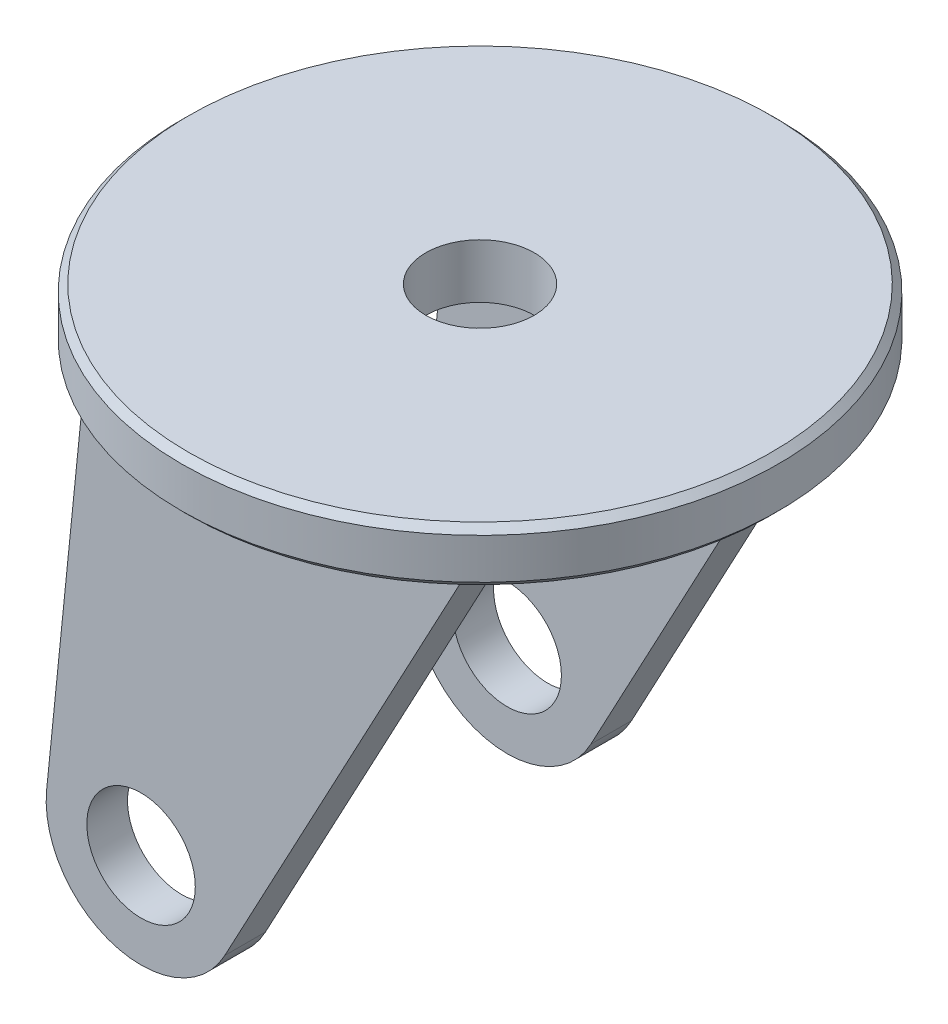
ISO-10303-21;
HEADER;
FILE_DESCRIPTION(('STEP AP214'),'2;1');
FILE_NAME('part.step','',(''),(''),'','','');
FILE_SCHEMA(('AUTOMOTIVE_DESIGN { 1 0 10303 214 1 1 1 1 }'));
ENDSEC;
DATA;
#1=APPLICATION_CONTEXT('core data for automotive mechanical design processes');
#2=APPLICATION_PROTOCOL_DEFINITION('international standard','automotive_design',2000,#1);
#3=PRODUCT_CONTEXT('',#1,'mechanical');
#4=PRODUCT('Part','Part','',(#3));
#5=PRODUCT_RELATED_PRODUCT_CATEGORY('part','',(#4));
#6=PRODUCT_DEFINITION_FORMATION('','',#4);
#7=PRODUCT_DEFINITION_CONTEXT('part definition',#1,'design');
#8=PRODUCT_DEFINITION('design','',#6,#7);
#9=PRODUCT_DEFINITION_SHAPE('','',#8);
#10=(LENGTH_UNIT() NAMED_UNIT(*) SI_UNIT(.MILLI.,.METRE.));
#11=(NAMED_UNIT(*) PLANE_ANGLE_UNIT() SI_UNIT($,.RADIAN.));
#12=(NAMED_UNIT(*) SI_UNIT($,.STERADIAN.) SOLID_ANGLE_UNIT());
#13=UNCERTAINTY_MEASURE_WITH_UNIT(LENGTH_MEASURE(1.E-05),#10,'distance_accuracy_value','');
#14=(GEOMETRIC_REPRESENTATION_CONTEXT(3) GLOBAL_UNCERTAINTY_ASSIGNED_CONTEXT((#13)) GLOBAL_UNIT_ASSIGNED_CONTEXT((#10,
#11,#12)) REPRESENTATION_CONTEXT('',''));
#15=CARTESIAN_POINT('',(0.,0.,0.));
#16=DIRECTION('',(0.,0.,1.));
#17=DIRECTION('',(1.,0.,0.));
#18=AXIS2_PLACEMENT_3D('',#15,#16,#17);
#19=CARTESIAN_POINT('',(0.,0.,0.));
#20=DIRECTION('',(0.,1.,0.));
#21=DIRECTION('',(0.,0.,1.));
#22=AXIS2_PLACEMENT_3D('',#19,#20,#21);
#23=PLANE('',#22);
#24=CARTESIAN_POINT('',(0.,0.,0.));
#25=DIRECTION('',(0.,1.,0.));
#26=DIRECTION('',(0.,0.,1.));
#27=AXIS2_PLACEMENT_3D('',#24,#25,#26);
#28=CIRCLE('',#27,2.);
#29=CARTESIAN_POINT('',(0.,0.,2.));
#30=VERTEX_POINT('',#29);
#31=EDGE_CURVE('E229',#30,#30,#28,.T.);
#32=ORIENTED_EDGE('',*,*,#31,.T.);
#33=EDGE_LOOP('',(#32));
#34=FACE_BOUND('',#33,.T.);
#35=DIRECTION('',(0.,0.,1.));
#36=VECTOR('',#35,1.);
#37=CARTESIAN_POINT('',(7.,0.,-7.5));
#38=LINE('',#37,#36);
#39=CARTESIAN_POINT('',(7.,0.,-7.5));
#40=VERTEX_POINT('',#39);
#41=CARTESIAN_POINT('',(7.,0.,-6.));
#42=VERTEX_POINT('',#41);
#43=EDGE_CURVE('E57',#40,#42,#38,.T.);
#44=ORIENTED_EDGE('',*,*,#43,.F.);
#45=DIRECTION('',(-1.,0.,0.));
#46=VECTOR('',#45,1.);
#47=CARTESIAN_POINT('',(-7.,0.,-7.5));
#48=LINE('',#47,#46);
#49=CARTESIAN_POINT('',(-7.,0.,-7.5));
#50=VERTEX_POINT('',#49);
#51=EDGE_CURVE('E62',#40,#50,#48,.T.);
#52=ORIENTED_EDGE('',*,*,#51,.T.);
#53=DIRECTION('',(0.,0.,1.));
#54=VECTOR('',#53,1.);
#55=CARTESIAN_POINT('',(-7.,0.,-7.5));
#56=LINE('',#55,#54);
#57=CARTESIAN_POINT('',(-7.,0.,-6.));
#58=VERTEX_POINT('',#57);
#59=EDGE_CURVE('E143',#50,#58,#56,.T.);
#60=ORIENTED_EDGE('',*,*,#59,.T.);
#61=DIRECTION('',(-1.,0.,0.));
#62=VECTOR('',#61,1.);
#63=CARTESIAN_POINT('',(-7.,0.,-6.));
#64=LINE('',#63,#62);
#65=EDGE_CURVE('E124',#42,#58,#64,.T.);
#66=ORIENTED_EDGE('',*,*,#65,.F.);
#67=EDGE_LOOP('',(#44,#52,#60,#66));
#68=FACE_BOUND('',#67,.T.);
#69=CARTESIAN_POINT('',(0.,0.,0.));
#70=DIRECTION('',(0.,1.,0.));
#71=DIRECTION('',(0.,0.,1.));
#72=AXIS2_PLACEMENT_3D('',#69,#70,#71);
#73=CIRCLE('',#72,10.75);
#74=CARTESIAN_POINT('',(0.,0.,10.75));
#75=VERTEX_POINT('',#74);
#76=EDGE_CURVE('E50',#75,#75,#73,.F.);
#77=ORIENTED_EDGE('',*,*,#76,.T.);
#78=EDGE_LOOP('',(#77));
#79=FACE_BOUND('',#78,.T.);
#80=DIRECTION('',(0.,0.,-1.));
#81=VECTOR('',#80,1.);
#82=CARTESIAN_POINT('',(7.,0.,7.5));
#83=LINE('',#82,#81);
#84=CARTESIAN_POINT('',(7.,0.,7.5));
#85=VERTEX_POINT('',#84);
#86=CARTESIAN_POINT('',(7.,0.,6.));
#87=VERTEX_POINT('',#86);
#88=EDGE_CURVE('E179',#85,#87,#83,.T.);
#89=ORIENTED_EDGE('',*,*,#88,.T.);
#90=DIRECTION('',(-1.,0.,0.));
#91=VECTOR('',#90,1.);
#92=CARTESIAN_POINT('',(-7.,0.,6.));
#93=LINE('',#92,#91);
#94=CARTESIAN_POINT('',(-7.,0.,6.));
#95=VERTEX_POINT('',#94);
#96=EDGE_CURVE('E166',#87,#95,#93,.T.);
#97=ORIENTED_EDGE('',*,*,#96,.T.);
#98=DIRECTION('',(0.,0.,-1.));
#99=VECTOR('',#98,1.);
#100=CARTESIAN_POINT('',(-7.,0.,7.5));
#101=LINE('',#100,#99);
#102=CARTESIAN_POINT('',(-7.,0.,7.5));
#103=VERTEX_POINT('',#102);
#104=EDGE_CURVE('E176',#103,#95,#101,.T.);
#105=ORIENTED_EDGE('',*,*,#104,.F.);
#106=DIRECTION('',(-1.,0.,0.));
#107=VECTOR('',#106,1.);
#108=CARTESIAN_POINT('',(-7.,0.,7.5));
#109=LINE('',#108,#107);
#110=EDGE_CURVE('E155',#85,#103,#109,.T.);
#111=ORIENTED_EDGE('',*,*,#110,.F.);
#112=EDGE_LOOP('',(#89,#97,#105,#111));
#113=FACE_BOUND('',#112,.T.);
#114=ADVANCED_FACE('F41',(#34,#68,#79,#113),#23,.F.);
#115=CARTESIAN_POINT('',(0.,2.,0.));
#116=DIRECTION('',(0.,-1.,0.));
#117=DIRECTION('',(0.,0.,-1.));
#118=AXIS2_PLACEMENT_3D('',#115,#116,#117);
#119=CYLINDRICAL_SURFACE('',#118,11.);
#120=CARTESIAN_POINT('',(0.,0.250000000000004,0.));
#121=DIRECTION('',(0.,1.,0.));
#122=DIRECTION('',(0.,0.,1.));
#123=AXIS2_PLACEMENT_3D('',#120,#121,#122);
#124=CIRCLE('',#123,11.);
#125=CARTESIAN_POINT('',(0.,0.250000000000004,11.));
#126=VERTEX_POINT('',#125);
#127=EDGE_CURVE('E184',#126,#126,#124,.T.);
#128=ORIENTED_EDGE('',*,*,#127,.T.);
#129=EDGE_LOOP('',(#128));
#130=FACE_BOUND('',#129,.T.);
#131=CARTESIAN_POINT('',(0.,1.75,0.));
#132=DIRECTION('',(0.,1.,0.));
#133=DIRECTION('',(0.,0.,1.));
#134=AXIS2_PLACEMENT_3D('',#131,#132,#133);
#135=CIRCLE('',#134,11.);
#136=CARTESIAN_POINT('',(0.,1.75,11.));
#137=VERTEX_POINT('',#136);
#138=EDGE_CURVE('E181',#137,#137,#135,.F.);
#139=ORIENTED_EDGE('',*,*,#138,.T.);
#140=EDGE_LOOP('',(#139));
#141=FACE_BOUND('',#140,.T.);
#142=ADVANCED_FACE('F197',(#130,#141),#119,.T.);
#143=CARTESIAN_POINT('',(0.,2.,0.));
#144=DIRECTION('',(0.,1.,0.));
#145=DIRECTION('',(0.,0.,1.));
#146=AXIS2_PLACEMENT_3D('',#143,#144,#145);
#147=PLANE('',#146);
#148=CARTESIAN_POINT('',(0.,2.,0.));
#149=DIRECTION('',(0.,1.,0.));
#150=DIRECTION('',(0.,0.,1.));
#151=AXIS2_PLACEMENT_3D('',#148,#149,#150);
#152=CIRCLE('',#151,2.);
#153=CARTESIAN_POINT('',(0.,2.,2.));
#154=VERTEX_POINT('',#153);
#155=EDGE_CURVE('E232',#154,#154,#152,.T.);
#156=ORIENTED_EDGE('',*,*,#155,.F.);
#157=EDGE_LOOP('',(#156));
#158=FACE_BOUND('',#157,.T.);
#159=CARTESIAN_POINT('',(0.,2.,0.));
#160=DIRECTION('',(0.,1.,0.));
#161=DIRECTION('',(0.,0.,1.));
#162=AXIS2_PLACEMENT_3D('',#159,#160,#161);
#163=CIRCLE('',#162,10.75);
#164=CARTESIAN_POINT('',(0.,2.,10.75));
#165=VERTEX_POINT('',#164);
#166=EDGE_CURVE('E11',#165,#165,#163,.T.);
#167=ORIENTED_EDGE('',*,*,#166,.T.);
#168=EDGE_LOOP('',(#167));
#169=FACE_BOUND('',#168,.T.);
#170=ADVANCED_FACE('F194',(#158,#169),#147,.T.);
#171=CARTESIAN_POINT('',(0.,0.250000000000004,0.));
#172=DIRECTION('',(0.,1.,0.));
#173=DIRECTION('',(0.,0.,1.));
#174=AXIS2_PLACEMENT_3D('',#171,#172,#173);
#175=CONICAL_SURFACE('',#174,11.,0.785398163397448);
#176=ORIENTED_EDGE('',*,*,#76,.F.);
#177=EDGE_LOOP('',(#176));
#178=FACE_BOUND('',#177,.T.);
#179=ORIENTED_EDGE('',*,*,#127,.F.);
#180=EDGE_LOOP('',(#179));
#181=FACE_BOUND('',#180,.T.);
#182=ADVANCED_FACE('F191',(#178,#181),#175,.T.);
#183=CARTESIAN_POINT('',(0.,2.,0.));
#184=DIRECTION('',(0.,-1.,0.));
#185=DIRECTION('',(0.,0.,-1.));
#186=AXIS2_PLACEMENT_3D('',#183,#184,#185);
#187=CONICAL_SURFACE('',#186,10.75,0.785398163397448);
#188=ORIENTED_EDGE('',*,*,#138,.F.);
#189=EDGE_LOOP('',(#188));
#190=FACE_BOUND('',#189,.T.);
#191=ORIENTED_EDGE('',*,*,#166,.F.);
#192=EDGE_LOOP('',(#191));
#193=FACE_BOUND('',#192,.T.);
#194=ADVANCED_FACE('F44',(#190,#193),#187,.T.);
#195=CARTESIAN_POINT('',(-5.,-15.,7.5));
#196=DIRECTION('',(0.,0.,1.));
#197=DIRECTION('',(1.,0.,0.));
#198=AXIS2_PLACEMENT_3D('',#195,#196,#197);
#199=PLANE('',#198);
#200=DIRECTION('',(0.471961846098345,0.881618974289598,0.));
#201=VECTOR('',#200,1.);
#202=CARTESIAN_POINT('',(7.,0.,7.5));
#203=LINE('',#202,#201);
#204=CARTESIAN_POINT('',(-1.91433358998641,-16.6518664613442,7.5));
#205=VERTEX_POINT('',#204);
#206=EDGE_CURVE('E152',#205,#85,#203,.T.);
#207=ORIENTED_EDGE('',*,*,#206,.T.);
#208=ORIENTED_EDGE('',*,*,#110,.T.);
#209=DIRECTION('',(-0.100677450966502,-0.994919117751231,0.));
#210=VECTOR('',#209,1.);
#211=CARTESIAN_POINT('',(-7.,0.,7.5));
#212=LINE('',#211,#210);
#213=CARTESIAN_POINT('',(-8.4822169121293,-14.6476289216172,7.5));
#214=VERTEX_POINT('',#213);
#215=EDGE_CURVE('E159',#103,#214,#212,.T.);
#216=ORIENTED_EDGE('',*,*,#215,.T.);
#217=CARTESIAN_POINT('',(-5.,-15.,7.5));
#218=DIRECTION('',(0.,0.,1.));
#219=DIRECTION('',(1.,0.,0.));
#220=AXIS2_PLACEMENT_3D('',#217,#218,#219);
#221=CIRCLE('',#220,3.5);
#222=EDGE_CURVE('E161',#214,#205,#221,.T.);
#223=ORIENTED_EDGE('',*,*,#222,.T.);
#224=EDGE_LOOP('',(#207,#208,#216,#223));
#225=FACE_BOUND('',#224,.T.);
#226=CARTESIAN_POINT('',(-5.,-15.,7.5));
#227=DIRECTION('',(0.,0.,1.));
#228=DIRECTION('',(1.,0.,0.));
#229=AXIS2_PLACEMENT_3D('',#226,#227,#228);
#230=CIRCLE('',#229,2.);
#231=CARTESIAN_POINT('',(-3.,-15.,7.5));
#232=VERTEX_POINT('',#231);
#233=EDGE_CURVE('E146',#232,#232,#230,.T.);
#234=ORIENTED_EDGE('',*,*,#233,.F.);
#235=EDGE_LOOP('',(#234));
#236=FACE_BOUND('',#235,.T.);
#237=ADVANCED_FACE('F205',(#225,#236),#199,.T.);
#238=CARTESIAN_POINT('',(-5.,-15.,6.));
#239=DIRECTION('',(0.,0.,1.));
#240=DIRECTION('',(1.,0.,0.));
#241=AXIS2_PLACEMENT_3D('',#238,#239,#240);
#242=PLANE('',#241);
#243=DIRECTION('',(0.471961846098345,0.881618974289598,0.));
#244=VECTOR('',#243,1.);
#245=CARTESIAN_POINT('',(7.,0.,6.));
#246=LINE('',#245,#244);
#247=CARTESIAN_POINT('',(-1.91433358998641,-16.6518664613442,6.));
#248=VERTEX_POINT('',#247);
#249=EDGE_CURVE('E149',#248,#87,#246,.T.);
#250=ORIENTED_EDGE('',*,*,#249,.F.);
#251=CARTESIAN_POINT('',(-5.,-15.,6.));
#252=DIRECTION('',(0.,0.,1.));
#253=DIRECTION('',(1.,0.,0.));
#254=AXIS2_PLACEMENT_3D('',#251,#252,#253);
#255=CIRCLE('',#254,3.5);
#256=CARTESIAN_POINT('',(-8.4822169121293,-14.6476289216172,6.));
#257=VERTEX_POINT('',#256);
#258=EDGE_CURVE('E156',#257,#248,#255,.T.);
#259=ORIENTED_EDGE('',*,*,#258,.F.);
#260=DIRECTION('',(-0.100677450966502,-0.994919117751231,0.));
#261=VECTOR('',#260,1.);
#262=CARTESIAN_POINT('',(-7.,0.,6.));
#263=LINE('',#262,#261);
#264=EDGE_CURVE('E168',#95,#257,#263,.T.);
#265=ORIENTED_EDGE('',*,*,#264,.F.);
#266=ORIENTED_EDGE('',*,*,#96,.F.);
#267=EDGE_LOOP('',(#250,#259,#265,#266));
#268=FACE_BOUND('',#267,.T.);
#269=CARTESIAN_POINT('',(-5.,-15.,6.));
#270=DIRECTION('',(0.,0.,1.));
#271=DIRECTION('',(1.,0.,0.));
#272=AXIS2_PLACEMENT_3D('',#269,#270,#271);
#273=CIRCLE('',#272,2.);
#274=CARTESIAN_POINT('',(-3.,-15.,6.));
#275=VERTEX_POINT('',#274);
#276=EDGE_CURVE('E115',#275,#275,#273,.T.);
#277=ORIENTED_EDGE('',*,*,#276,.T.);
#278=EDGE_LOOP('',(#277));
#279=FACE_BOUND('',#278,.T.);
#280=ADVANCED_FACE('F274',(#268,#279),#242,.F.);
#281=CARTESIAN_POINT('',(7.,0.,7.5));
#282=DIRECTION('',(-0.881618974289598,0.471961846098345,0.));
#283=DIRECTION('',(-0.471961846098345,-0.881618974289598,0.));
#284=AXIS2_PLACEMENT_3D('',#281,#282,#283);
#285=PLANE('',#284);
#286=ORIENTED_EDGE('',*,*,#249,.T.);
#287=ORIENTED_EDGE('',*,*,#88,.F.);
#288=ORIENTED_EDGE('',*,*,#206,.F.);
#289=DIRECTION('',(0.,0.,-1.));
#290=VECTOR('',#289,1.);
#291=CARTESIAN_POINT('',(-1.91433358998641,-16.6518664613442,7.5));
#292=LINE('',#291,#290);
#293=EDGE_CURVE('E163',#205,#248,#292,.T.);
#294=ORIENTED_EDGE('',*,*,#293,.T.);
#295=EDGE_LOOP('',(#286,#287,#288,#294));
#296=FACE_BOUND('',#295,.T.);
#297=ADVANCED_FACE('F278',(#296),#285,.F.);
#298=CARTESIAN_POINT('',(-7.,0.,7.5));
#299=DIRECTION('',(0.994919117751231,-0.100677450966502,0.));
#300=DIRECTION('',(0.100677450966502,0.994919117751231,0.));
#301=AXIS2_PLACEMENT_3D('',#298,#299,#300);
#302=PLANE('',#301);
#303=ORIENTED_EDGE('',*,*,#264,.T.);
#304=DIRECTION('',(0.,0.,-1.));
#305=VECTOR('',#304,1.);
#306=CARTESIAN_POINT('',(-8.4822169121293,-14.6476289216172,7.5));
#307=LINE('',#306,#305);
#308=EDGE_CURVE('E173',#214,#257,#307,.T.);
#309=ORIENTED_EDGE('',*,*,#308,.F.);
#310=ORIENTED_EDGE('',*,*,#215,.F.);
#311=ORIENTED_EDGE('',*,*,#104,.T.);
#312=EDGE_LOOP('',(#303,#309,#310,#311));
#313=FACE_BOUND('',#312,.T.);
#314=ADVANCED_FACE('F282',(#313),#302,.F.);
#315=CARTESIAN_POINT('',(-5.,-15.,7.5));
#316=DIRECTION('',(0.,0.,-1.));
#317=DIRECTION('',(-1.,0.,0.));
#318=AXIS2_PLACEMENT_3D('',#315,#316,#317);
#319=CYLINDRICAL_SURFACE('',#318,3.5);
#320=ORIENTED_EDGE('',*,*,#258,.T.);
#321=ORIENTED_EDGE('',*,*,#293,.F.);
#322=ORIENTED_EDGE('',*,*,#222,.F.);
#323=ORIENTED_EDGE('',*,*,#308,.T.);
#324=EDGE_LOOP('',(#320,#321,#322,#323));
#325=FACE_BOUND('',#324,.T.);
#326=ADVANCED_FACE('F270',(#325),#319,.T.);
#327=CARTESIAN_POINT('',(-5.,-15.,7.5));
#328=DIRECTION('',(0.,0.,-1.));
#329=DIRECTION('',(-1.,0.,0.));
#330=AXIS2_PLACEMENT_3D('',#327,#328,#329);
#331=CYLINDRICAL_SURFACE('',#330,2.);
#332=ORIENTED_EDGE('',*,*,#233,.T.);
#333=EDGE_LOOP('',(#332));
#334=FACE_BOUND('',#333,.T.);
#335=ORIENTED_EDGE('',*,*,#276,.F.);
#336=EDGE_LOOP('',(#335));
#337=FACE_BOUND('',#336,.T.);
#338=ADVANCED_FACE('F267',(#334,#337),#331,.F.);
#339=CARTESIAN_POINT('',(7.,0.,-7.5));
#340=DIRECTION('',(0.881618974289598,-0.471961846098345,0.));
#341=DIRECTION('',(0.471961846098345,0.881618974289598,0.));
#342=AXIS2_PLACEMENT_3D('',#339,#340,#341);
#343=PLANE('',#342);
#344=DIRECTION('',(0.471961846098345,0.881618974289598,0.));
#345=VECTOR('',#344,1.);
#346=CARTESIAN_POINT('',(7.,0.,-6.));
#347=LINE('',#346,#345);
#348=CARTESIAN_POINT('',(-1.91433358998641,-16.6518664613442,-6.));
#349=VERTEX_POINT('',#348);
#350=EDGE_CURVE('E110',#349,#42,#347,.T.);
#351=ORIENTED_EDGE('',*,*,#350,.F.);
#352=DIRECTION('',(0.,0.,1.));
#353=VECTOR('',#352,1.);
#354=CARTESIAN_POINT('',(-1.91433358998641,-16.6518664613442,-7.5));
#355=LINE('',#354,#353);
#356=CARTESIAN_POINT('',(-1.91433358998641,-16.6518664613442,-7.5));
#357=VERTEX_POINT('',#356);
#358=EDGE_CURVE('E105',#357,#349,#355,.T.);
#359=ORIENTED_EDGE('',*,*,#358,.F.);
#360=DIRECTION('',(0.471961846098345,0.881618974289598,0.));
#361=VECTOR('',#360,1.);
#362=CARTESIAN_POINT('',(7.,0.,-7.5));
#363=LINE('',#362,#361);
#364=EDGE_CURVE('E108',#357,#40,#363,.T.);
#365=ORIENTED_EDGE('',*,*,#364,.T.);
#366=ORIENTED_EDGE('',*,*,#43,.T.);
#367=EDGE_LOOP('',(#351,#359,#365,#366));
#368=FACE_BOUND('',#367,.T.);
#369=ADVANCED_FACE('F107',(#368),#343,.T.);
#370=CARTESIAN_POINT('',(-5.,-15.,-7.5));
#371=DIRECTION('',(0.,0.,1.));
#372=DIRECTION('',(1.,0.,0.));
#373=AXIS2_PLACEMENT_3D('',#370,#371,#372);
#374=CYLINDRICAL_SURFACE('',#373,3.5);
#375=CARTESIAN_POINT('',(-5.,-15.,-6.));
#376=DIRECTION('',(0.,0.,1.));
#377=DIRECTION('',(1.,0.,0.));
#378=AXIS2_PLACEMENT_3D('',#375,#376,#377);
#379=CIRCLE('',#378,3.5);
#380=CARTESIAN_POINT('',(-8.4822169121293,-14.6476289216172,-6.));
#381=VERTEX_POINT('',#380);
#382=EDGE_CURVE('E134',#381,#349,#379,.T.);
#383=ORIENTED_EDGE('',*,*,#382,.F.);
#384=DIRECTION('',(0.,0.,1.));
#385=VECTOR('',#384,1.);
#386=CARTESIAN_POINT('',(-8.4822169121293,-14.6476289216172,-7.5));
#387=LINE('',#386,#385);
#388=CARTESIAN_POINT('',(-8.4822169121293,-14.6476289216172,-7.5));
#389=VERTEX_POINT('',#388);
#390=EDGE_CURVE('E116',#389,#381,#387,.T.);
#391=ORIENTED_EDGE('',*,*,#390,.F.);
#392=CARTESIAN_POINT('',(-5.,-15.,-7.5));
#393=DIRECTION('',(0.,0.,1.));
#394=DIRECTION('',(1.,0.,0.));
#395=AXIS2_PLACEMENT_3D('',#392,#393,#394);
#396=CIRCLE('',#395,3.5);
#397=EDGE_CURVE('E122',#389,#357,#396,.T.);
#398=ORIENTED_EDGE('',*,*,#397,.T.);
#399=ORIENTED_EDGE('',*,*,#358,.T.);
#400=EDGE_LOOP('',(#383,#391,#398,#399));
#401=FACE_BOUND('',#400,.T.);
#402=ADVANCED_FACE('F126',(#401),#374,.T.);
#403=CARTESIAN_POINT('',(-7.,0.,-7.5));
#404=DIRECTION('',(-0.994919117751231,0.100677450966502,0.));
#405=DIRECTION('',(-0.100677450966502,-0.994919117751231,0.));
#406=AXIS2_PLACEMENT_3D('',#403,#404,#405);
#407=PLANE('',#406);
#408=DIRECTION('',(-0.100677450966502,-0.994919117751231,0.));
#409=VECTOR('',#408,1.);
#410=CARTESIAN_POINT('',(-7.,0.,-6.));
#411=LINE('',#410,#409);
#412=EDGE_CURVE('E137',#58,#381,#411,.T.);
#413=ORIENTED_EDGE('',*,*,#412,.F.);
#414=ORIENTED_EDGE('',*,*,#59,.F.);
#415=DIRECTION('',(-0.100677450966502,-0.994919117751231,0.));
#416=VECTOR('',#415,1.);
#417=CARTESIAN_POINT('',(-7.,0.,-7.5));
#418=LINE('',#417,#416);
#419=EDGE_CURVE('E127',#50,#389,#418,.T.);
#420=ORIENTED_EDGE('',*,*,#419,.T.);
#421=ORIENTED_EDGE('',*,*,#390,.T.);
#422=EDGE_LOOP('',(#413,#414,#420,#421));
#423=FACE_BOUND('',#422,.T.);
#424=ADVANCED_FACE('F255',(#423),#407,.T.);
#425=CARTESIAN_POINT('',(-5.,-15.,-7.5));
#426=DIRECTION('',(0.,0.,-1.));
#427=DIRECTION('',(1.,0.,0.));
#428=AXIS2_PLACEMENT_3D('',#425,#426,#427);
#429=PLANE('',#428);
#430=CARTESIAN_POINT('',(-5.,-15.,-7.5));
#431=DIRECTION('',(0.,0.,1.));
#432=DIRECTION('',(1.,0.,0.));
#433=AXIS2_PLACEMENT_3D('',#430,#431,#432);
#434=CIRCLE('',#433,2.);
#435=CARTESIAN_POINT('',(-3.,-15.,-7.5));
#436=VERTEX_POINT('',#435);
#437=EDGE_CURVE('E135',#436,#436,#434,.T.);
#438=ORIENTED_EDGE('',*,*,#437,.T.);
#439=EDGE_LOOP('',(#438));
#440=FACE_BOUND('',#439,.T.);
#441=ORIENTED_EDGE('',*,*,#364,.F.);
#442=ORIENTED_EDGE('',*,*,#397,.F.);
#443=ORIENTED_EDGE('',*,*,#419,.F.);
#444=ORIENTED_EDGE('',*,*,#51,.F.);
#445=EDGE_LOOP('',(#441,#442,#443,#444));
#446=FACE_BOUND('',#445,.T.);
#447=ADVANCED_FACE('F120',(#440,#446),#429,.T.);
#448=CARTESIAN_POINT('',(-5.,-15.,-6.));
#449=DIRECTION('',(0.,0.,-1.));
#450=DIRECTION('',(1.,0.,0.));
#451=AXIS2_PLACEMENT_3D('',#448,#449,#450);
#452=PLANE('',#451);
#453=CARTESIAN_POINT('',(-5.,-15.,-6.));
#454=DIRECTION('',(0.,0.,1.));
#455=DIRECTION('',(1.,0.,0.));
#456=AXIS2_PLACEMENT_3D('',#453,#454,#455);
#457=CIRCLE('',#456,2.);
#458=CARTESIAN_POINT('',(-3.,-15.,-6.));
#459=VERTEX_POINT('',#458);
#460=EDGE_CURVE('E231',#459,#459,#457,.T.);
#461=ORIENTED_EDGE('',*,*,#460,.F.);
#462=EDGE_LOOP('',(#461));
#463=FACE_BOUND('',#462,.T.);
#464=ORIENTED_EDGE('',*,*,#350,.T.);
#465=ORIENTED_EDGE('',*,*,#65,.T.);
#466=ORIENTED_EDGE('',*,*,#412,.T.);
#467=ORIENTED_EDGE('',*,*,#382,.T.);
#468=EDGE_LOOP('',(#464,#465,#466,#467));
#469=FACE_BOUND('',#468,.T.);
#470=ADVANCED_FACE('F246',(#463,#469),#452,.F.);
#471=CARTESIAN_POINT('',(-5.,-15.,-7.5));
#472=DIRECTION('',(0.,0.,1.));
#473=DIRECTION('',(1.,0.,0.));
#474=AXIS2_PLACEMENT_3D('',#471,#472,#473);
#475=CYLINDRICAL_SURFACE('',#474,2.);
#476=ORIENTED_EDGE('',*,*,#437,.F.);
#477=EDGE_LOOP('',(#476));
#478=FACE_BOUND('',#477,.T.);
#479=ORIENTED_EDGE('',*,*,#460,.T.);
#480=EDGE_LOOP('',(#479));
#481=FACE_BOUND('',#480,.T.);
#482=ADVANCED_FACE('F242',(#478,#481),#475,.F.);
#483=CARTESIAN_POINT('',(0.,-18.5,0.));
#484=DIRECTION('',(0.,1.,0.));
#485=DIRECTION('',(0.,0.,1.));
#486=AXIS2_PLACEMENT_3D('',#483,#484,#485);
#487=CYLINDRICAL_SURFACE('',#486,2.);
#488=ORIENTED_EDGE('',*,*,#155,.T.);
#489=EDGE_LOOP('',(#488));
#490=FACE_BOUND('',#489,.T.);
#491=ORIENTED_EDGE('',*,*,#31,.F.);
#492=EDGE_LOOP('',(#491));
#493=FACE_BOUND('',#492,.T.);
#494=ADVANCED_FACE('F245',(#490,#493),#487,.F.);
#495=CLOSED_SHELL('',(#114,#142,#170,#182,#194,#237,#280,#297,#314,#326,#338,#369,#402,#424,
#447,#470,#482,#494));
#496=MANIFOLD_SOLID_BREP('B2',#495);
#497=ADVANCED_BREP_SHAPE_REPRESENTATION('',(#18,#496),#14);
#498=SHAPE_DEFINITION_REPRESENTATION(#9,#497);
ENDSEC;
END-ISO-10303-21;
